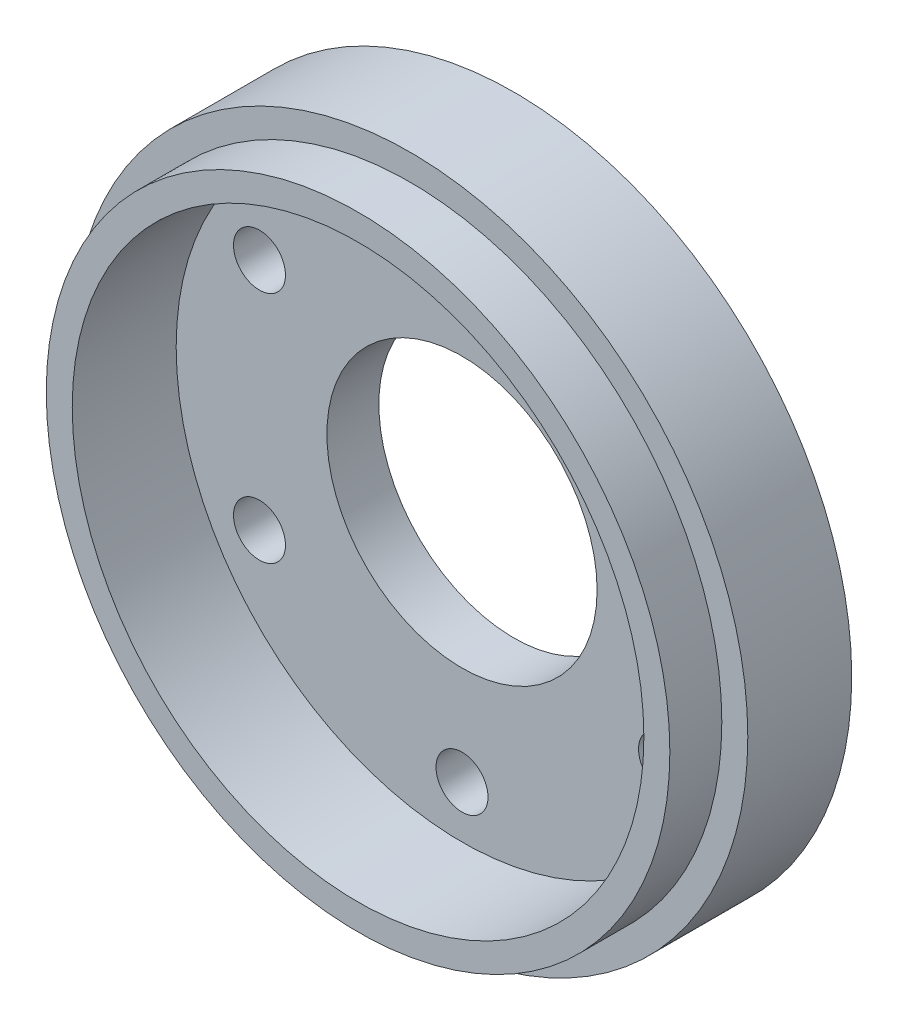
ISO-10303-21;
HEADER;
FILE_DESCRIPTION(('STEP AP214'),'2;1');
FILE_NAME('part.step','',(''),(''),'','','');
FILE_SCHEMA(('AUTOMOTIVE_DESIGN { 1 0 10303 214 1 1 1 1 }'));
ENDSEC;
DATA;
#1=APPLICATION_CONTEXT('core data for automotive mechanical design processes');
#2=APPLICATION_PROTOCOL_DEFINITION('international standard','automotive_design',2000,#1);
#3=PRODUCT_CONTEXT('',#1,'mechanical');
#4=PRODUCT('Part','Part','',(#3));
#5=PRODUCT_RELATED_PRODUCT_CATEGORY('part','',(#4));
#6=PRODUCT_DEFINITION_FORMATION('','',#4);
#7=PRODUCT_DEFINITION_CONTEXT('part definition',#1,'design');
#8=PRODUCT_DEFINITION('design','',#6,#7);
#9=PRODUCT_DEFINITION_SHAPE('','',#8);
#10=(LENGTH_UNIT() NAMED_UNIT(*) SI_UNIT(.MILLI.,.METRE.));
#11=(NAMED_UNIT(*) PLANE_ANGLE_UNIT() SI_UNIT($,.RADIAN.));
#12=(NAMED_UNIT(*) SI_UNIT($,.STERADIAN.) SOLID_ANGLE_UNIT());
#13=UNCERTAINTY_MEASURE_WITH_UNIT(LENGTH_MEASURE(1.E-05),#10,'distance_accuracy_value','');
#14=(GEOMETRIC_REPRESENTATION_CONTEXT(3) GLOBAL_UNCERTAINTY_ASSIGNED_CONTEXT((#13)) GLOBAL_UNIT_ASSIGNED_CONTEXT((#10,
#11,#12)) REPRESENTATION_CONTEXT('',''));
#15=CARTESIAN_POINT('',(0.,0.,0.));
#16=DIRECTION('',(0.,0.,1.));
#17=DIRECTION('',(1.,0.,0.));
#18=AXIS2_PLACEMENT_3D('',#15,#16,#17);
#19=CARTESIAN_POINT('',(0.,0.,10.));
#20=DIRECTION('',(0.,0.,1.));
#21=DIRECTION('',(1.,0.,0.));
#22=AXIS2_PLACEMENT_3D('',#19,#20,#21);
#23=PLANE('',#22);
#24=CARTESIAN_POINT('',(0.,0.,10.));
#25=DIRECTION('',(0.,0.,1.));
#26=DIRECTION('',(1.,0.,0.));
#27=AXIS2_PLACEMENT_3D('',#24,#25,#26);
#28=CIRCLE('',#27,32.5);
#29=CARTESIAN_POINT('',(32.5,0.,10.));
#30=VERTEX_POINT('',#29);
#31=EDGE_CURVE('E68',#30,#30,#28,.T.);
#32=ORIENTED_EDGE('',*,*,#31,.T.);
#33=EDGE_LOOP('',(#32));
#34=FACE_BOUND('',#33,.T.);
#35=CARTESIAN_POINT('',(0.,0.,10.));
#36=DIRECTION('',(0.,0.,1.));
#37=DIRECTION('',(1.,0.,0.));
#38=AXIS2_PLACEMENT_3D('',#35,#36,#37);
#39=CIRCLE('',#38,30.);
#40=CARTESIAN_POINT('',(30.,0.,10.));
#41=VERTEX_POINT('',#40);
#42=EDGE_CURVE('E122',#41,#41,#39,.T.);
#43=ORIENTED_EDGE('',*,*,#42,.F.);
#44=EDGE_LOOP('',(#43));
#45=FACE_BOUND('',#44,.T.);
#46=ADVANCED_FACE('F43',(#34,#45),#23,.T.);
#47=CARTESIAN_POINT('',(0.,0.,5.));
#48=DIRECTION('',(0.,0.,1.));
#49=DIRECTION('',(1.,0.,0.));
#50=AXIS2_PLACEMENT_3D('',#47,#48,#49);
#51=PLANE('',#50);
#52=CARTESIAN_POINT('',(0.,22.5,5.));
#53=DIRECTION('',(0.,0.,1.));
#54=DIRECTION('',(1.,0.,0.));
#55=AXIS2_PLACEMENT_3D('',#52,#53,#54);
#56=CIRCLE('',#55,2.5);
#57=CARTESIAN_POINT('',(2.5,22.5,5.));
#58=VERTEX_POINT('',#57);
#59=EDGE_CURVE('E107',#58,#58,#56,.T.);
#60=ORIENTED_EDGE('',*,*,#59,.F.);
#61=EDGE_LOOP('',(#60));
#62=FACE_BOUND('',#61,.T.);
#63=CARTESIAN_POINT('',(-19.4855715851499,11.25,5.));
#64=DIRECTION('',(0.,0.,1.));
#65=DIRECTION('',(1.,0.,0.));
#66=AXIS2_PLACEMENT_3D('',#63,#64,#65);
#67=CIRCLE('',#66,2.5);
#68=CARTESIAN_POINT('',(-16.9855715851499,11.25,5.));
#69=VERTEX_POINT('',#68);
#70=EDGE_CURVE('E79',#69,#69,#67,.T.);
#71=ORIENTED_EDGE('',*,*,#70,.F.);
#72=EDGE_LOOP('',(#71));
#73=FACE_BOUND('',#72,.T.);
#74=CARTESIAN_POINT('',(-19.4855715851499,-11.25,5.));
#75=DIRECTION('',(0.,0.,1.));
#76=DIRECTION('',(1.,0.,0.));
#77=AXIS2_PLACEMENT_3D('',#74,#75,#76);
#78=CIRCLE('',#77,2.49999999999999);
#79=CARTESIAN_POINT('',(-16.9855715851499,-11.25,5.));
#80=VERTEX_POINT('',#79);
#81=EDGE_CURVE('E78',#80,#80,#78,.T.);
#82=ORIENTED_EDGE('',*,*,#81,.F.);
#83=EDGE_LOOP('',(#82));
#84=FACE_BOUND('',#83,.T.);
#85=CARTESIAN_POINT('',(0.,-22.5,5.));
#86=DIRECTION('',(0.,0.,1.));
#87=DIRECTION('',(1.,0.,0.));
#88=AXIS2_PLACEMENT_3D('',#85,#86,#87);
#89=CIRCLE('',#88,2.5);
#90=CARTESIAN_POINT('',(2.50000000000001,-22.5,5.));
#91=VERTEX_POINT('',#90);
#92=EDGE_CURVE('E87',#91,#91,#89,.T.);
#93=ORIENTED_EDGE('',*,*,#92,.F.);
#94=EDGE_LOOP('',(#93));
#95=FACE_BOUND('',#94,.T.);
#96=CARTESIAN_POINT('',(19.4855715851499,-11.25,5.));
#97=DIRECTION('',(0.,0.,1.));
#98=DIRECTION('',(1.,0.,0.));
#99=AXIS2_PLACEMENT_3D('',#96,#97,#98);
#100=CIRCLE('',#99,2.5);
#101=CARTESIAN_POINT('',(21.9855715851499,-11.25,5.));
#102=VERTEX_POINT('',#101);
#103=EDGE_CURVE('E95',#102,#102,#100,.T.);
#104=ORIENTED_EDGE('',*,*,#103,.F.);
#105=EDGE_LOOP('',(#104));
#106=FACE_BOUND('',#105,.T.);
#107=CARTESIAN_POINT('',(19.4855715851499,11.25,5.));
#108=DIRECTION('',(0.,0.,1.));
#109=DIRECTION('',(1.,0.,0.));
#110=AXIS2_PLACEMENT_3D('',#107,#108,#109);
#111=CIRCLE('',#110,2.5);
#112=CARTESIAN_POINT('',(21.9855715851499,11.25,5.));
#113=VERTEX_POINT('',#112);
#114=EDGE_CURVE('E103',#113,#113,#111,.T.);
#115=ORIENTED_EDGE('',*,*,#114,.F.);
#116=EDGE_LOOP('',(#115));
#117=FACE_BOUND('',#116,.T.);
#118=CARTESIAN_POINT('',(0.,0.,5.));
#119=DIRECTION('',(0.,0.,1.));
#120=DIRECTION('',(1.,0.,0.));
#121=AXIS2_PLACEMENT_3D('',#118,#119,#120);
#122=CIRCLE('',#121,13.);
#123=CARTESIAN_POINT('',(13.,0.,5.));
#124=VERTEX_POINT('',#123);
#125=EDGE_CURVE('E57',#124,#124,#122,.T.);
#126=ORIENTED_EDGE('',*,*,#125,.F.);
#127=EDGE_LOOP('',(#126));
#128=FACE_BOUND('',#127,.T.);
#129=CARTESIAN_POINT('',(0.,0.,5.));
#130=DIRECTION('',(0.,0.,1.));
#131=DIRECTION('',(1.,0.,0.));
#132=AXIS2_PLACEMENT_3D('',#129,#130,#131);
#133=CIRCLE('',#132,27.5);
#134=CARTESIAN_POINT('',(27.5,0.,5.));
#135=VERTEX_POINT('',#134);
#136=EDGE_CURVE('E10',#135,#135,#133,.F.);
#137=ORIENTED_EDGE('',*,*,#136,.F.);
#138=EDGE_LOOP('',(#137));
#139=FACE_BOUND('',#138,.T.);
#140=ADVANCED_FACE('F154',(#62,#73,#84,#95,#106,#117,#128,#139),#51,.T.);
#141=CARTESIAN_POINT('',(0.,0.,0.));
#142=DIRECTION('',(0.,0.,1.));
#143=DIRECTION('',(1.,0.,0.));
#144=AXIS2_PLACEMENT_3D('',#141,#142,#143);
#145=PLANE('',#144);
#146=CARTESIAN_POINT('',(0.,22.5,0.));
#147=DIRECTION('',(0.,0.,1.));
#148=DIRECTION('',(1.,0.,0.));
#149=AXIS2_PLACEMENT_3D('',#146,#147,#148);
#150=CIRCLE('',#149,2.5);
#151=CARTESIAN_POINT('',(2.5,22.5,0.));
#152=VERTEX_POINT('',#151);
#153=EDGE_CURVE('E73',#152,#152,#150,.T.);
#154=ORIENTED_EDGE('',*,*,#153,.T.);
#155=EDGE_LOOP('',(#154));
#156=FACE_BOUND('',#155,.T.);
#157=CARTESIAN_POINT('',(-19.4855715851499,11.25,0.));
#158=DIRECTION('',(0.,0.,1.));
#159=DIRECTION('',(1.,0.,0.));
#160=AXIS2_PLACEMENT_3D('',#157,#158,#159);
#161=CIRCLE('',#160,2.5);
#162=CARTESIAN_POINT('',(-16.9855715851499,11.25,0.));
#163=VERTEX_POINT('',#162);
#164=EDGE_CURVE('E108',#163,#163,#161,.T.);
#165=ORIENTED_EDGE('',*,*,#164,.T.);
#166=EDGE_LOOP('',(#165));
#167=FACE_BOUND('',#166,.T.);
#168=CARTESIAN_POINT('',(-19.4855715851499,-11.25,0.));
#169=DIRECTION('',(0.,0.,1.));
#170=DIRECTION('',(1.,0.,0.));
#171=AXIS2_PLACEMENT_3D('',#168,#169,#170);
#172=CIRCLE('',#171,2.49999999999999);
#173=CARTESIAN_POINT('',(-16.9855715851499,-11.25,0.));
#174=VERTEX_POINT('',#173);
#175=EDGE_CURVE('E74',#174,#174,#172,.T.);
#176=ORIENTED_EDGE('',*,*,#175,.T.);
#177=EDGE_LOOP('',(#176));
#178=FACE_BOUND('',#177,.T.);
#179=CARTESIAN_POINT('',(0.,-22.5,0.));
#180=DIRECTION('',(0.,0.,1.));
#181=DIRECTION('',(1.,0.,0.));
#182=AXIS2_PLACEMENT_3D('',#179,#180,#181);
#183=CIRCLE('',#182,2.5);
#184=CARTESIAN_POINT('',(2.50000000000001,-22.5,0.));
#185=VERTEX_POINT('',#184);
#186=EDGE_CURVE('E83',#185,#185,#183,.T.);
#187=ORIENTED_EDGE('',*,*,#186,.T.);
#188=EDGE_LOOP('',(#187));
#189=FACE_BOUND('',#188,.T.);
#190=CARTESIAN_POINT('',(19.4855715851499,-11.25,0.));
#191=DIRECTION('',(0.,0.,1.));
#192=DIRECTION('',(1.,0.,0.));
#193=AXIS2_PLACEMENT_3D('',#190,#191,#192);
#194=CIRCLE('',#193,2.5);
#195=CARTESIAN_POINT('',(21.9855715851499,-11.25,0.));
#196=VERTEX_POINT('',#195);
#197=EDGE_CURVE('E91',#196,#196,#194,.T.);
#198=ORIENTED_EDGE('',*,*,#197,.T.);
#199=EDGE_LOOP('',(#198));
#200=FACE_BOUND('',#199,.T.);
#201=CARTESIAN_POINT('',(19.4855715851499,11.25,0.));
#202=DIRECTION('',(0.,0.,1.));
#203=DIRECTION('',(1.,0.,0.));
#204=AXIS2_PLACEMENT_3D('',#201,#202,#203);
#205=CIRCLE('',#204,2.5);
#206=CARTESIAN_POINT('',(21.9855715851499,11.25,0.));
#207=VERTEX_POINT('',#206);
#208=EDGE_CURVE('E99',#207,#207,#205,.T.);
#209=ORIENTED_EDGE('',*,*,#208,.T.);
#210=EDGE_LOOP('',(#209));
#211=FACE_BOUND('',#210,.T.);
#212=CARTESIAN_POINT('',(0.,0.,0.));
#213=DIRECTION('',(0.,0.,1.));
#214=DIRECTION('',(1.,0.,0.));
#215=AXIS2_PLACEMENT_3D('',#212,#213,#214);
#216=CIRCLE('',#215,32.5);
#217=CARTESIAN_POINT('',(32.5,0.,0.));
#218=VERTEX_POINT('',#217);
#219=EDGE_CURVE('E51',#218,#218,#216,.T.);
#220=ORIENTED_EDGE('',*,*,#219,.F.);
#221=EDGE_LOOP('',(#220));
#222=FACE_BOUND('',#221,.T.);
#223=CARTESIAN_POINT('',(0.,0.,0.));
#224=DIRECTION('',(0.,0.,1.));
#225=DIRECTION('',(1.,0.,0.));
#226=AXIS2_PLACEMENT_3D('',#223,#224,#225);
#227=CIRCLE('',#226,13.);
#228=CARTESIAN_POINT('',(13.,0.,0.));
#229=VERTEX_POINT('',#228);
#230=EDGE_CURVE('E63',#229,#229,#227,.T.);
#231=ORIENTED_EDGE('',*,*,#230,.T.);
#232=EDGE_LOOP('',(#231));
#233=FACE_BOUND('',#232,.T.);
#234=ADVANCED_FACE('F161',(#156,#167,#178,#189,#200,#211,#222,#233),#145,.F.);
#235=CARTESIAN_POINT('',(0.,0.,5.));
#236=DIRECTION('',(0.,0.,-1.));
#237=DIRECTION('',(-1.,0.,0.));
#238=AXIS2_PLACEMENT_3D('',#235,#236,#237);
#239=CYLINDRICAL_SURFACE('',#238,32.5);
#240=ORIENTED_EDGE('',*,*,#219,.T.);
#241=EDGE_LOOP('',(#240));
#242=FACE_BOUND('',#241,.T.);
#243=ORIENTED_EDGE('',*,*,#31,.F.);
#244=EDGE_LOOP('',(#243));
#245=FACE_BOUND('',#244,.T.);
#246=ADVANCED_FACE('F45',(#242,#245),#239,.T.);
#247=CARTESIAN_POINT('',(0.,0.,5.));
#248=DIRECTION('',(0.,0.,-1.));
#249=DIRECTION('',(-1.,0.,0.));
#250=AXIS2_PLACEMENT_3D('',#247,#248,#249);
#251=CYLINDRICAL_SURFACE('',#250,13.);
#252=ORIENTED_EDGE('',*,*,#125,.T.);
#253=EDGE_LOOP('',(#252));
#254=FACE_BOUND('',#253,.T.);
#255=ORIENTED_EDGE('',*,*,#230,.F.);
#256=EDGE_LOOP('',(#255));
#257=FACE_BOUND('',#256,.T.);
#258=ADVANCED_FACE('F168',(#254,#257),#251,.F.);
#259=CARTESIAN_POINT('',(0.,0.,10.));
#260=DIRECTION('',(0.,0.,-1.));
#261=DIRECTION('',(-1.,0.,0.));
#262=AXIS2_PLACEMENT_3D('',#259,#260,#261);
#263=CYLINDRICAL_SURFACE('',#262,27.5);
#264=ORIENTED_EDGE('',*,*,#136,.T.);
#265=EDGE_LOOP('',(#264));
#266=FACE_BOUND('',#265,.T.);
#267=CARTESIAN_POINT('',(0.,0.,15.));
#268=DIRECTION('',(0.,0.,1.));
#269=DIRECTION('',(1.,0.,0.));
#270=AXIS2_PLACEMENT_3D('',#267,#268,#269);
#271=CIRCLE('',#270,27.5);
#272=CARTESIAN_POINT('',(27.5,0.,15.));
#273=VERTEX_POINT('',#272);
#274=EDGE_CURVE('E126',#273,#273,#271,.T.);
#275=ORIENTED_EDGE('',*,*,#274,.T.);
#276=EDGE_LOOP('',(#275));
#277=FACE_BOUND('',#276,.T.);
#278=ADVANCED_FACE('F135',(#266,#277),#263,.F.);
#279=CARTESIAN_POINT('',(19.4855715851499,11.25,0.));
#280=DIRECTION('',(0.,0.,1.));
#281=DIRECTION('',(1.,0.,0.));
#282=AXIS2_PLACEMENT_3D('',#279,#280,#281);
#283=CYLINDRICAL_SURFACE('',#282,2.5);
#284=ORIENTED_EDGE('',*,*,#208,.F.);
#285=EDGE_LOOP('',(#284));
#286=FACE_BOUND('',#285,.T.);
#287=ORIENTED_EDGE('',*,*,#114,.T.);
#288=EDGE_LOOP('',(#287));
#289=FACE_BOUND('',#288,.T.);
#290=ADVANCED_FACE('F193',(#286,#289),#283,.F.);
#291=CARTESIAN_POINT('',(19.4855715851499,-11.25,0.));
#292=DIRECTION('',(0.,0.,1.));
#293=DIRECTION('',(1.,0.,0.));
#294=AXIS2_PLACEMENT_3D('',#291,#292,#293);
#295=CYLINDRICAL_SURFACE('',#294,2.5);
#296=ORIENTED_EDGE('',*,*,#197,.F.);
#297=EDGE_LOOP('',(#296));
#298=FACE_BOUND('',#297,.T.);
#299=ORIENTED_EDGE('',*,*,#103,.T.);
#300=EDGE_LOOP('',(#299));
#301=FACE_BOUND('',#300,.T.);
#302=ADVANCED_FACE('F196',(#298,#301),#295,.F.);
#303=CARTESIAN_POINT('',(0.,-22.5,0.));
#304=DIRECTION('',(0.,0.,1.));
#305=DIRECTION('',(1.,0.,0.));
#306=AXIS2_PLACEMENT_3D('',#303,#304,#305);
#307=CYLINDRICAL_SURFACE('',#306,2.5);
#308=ORIENTED_EDGE('',*,*,#186,.F.);
#309=EDGE_LOOP('',(#308));
#310=FACE_BOUND('',#309,.T.);
#311=ORIENTED_EDGE('',*,*,#92,.T.);
#312=EDGE_LOOP('',(#311));
#313=FACE_BOUND('',#312,.T.);
#314=ADVANCED_FACE('F205',(#310,#313),#307,.F.);
#315=CARTESIAN_POINT('',(-19.4855715851499,-11.25,0.));
#316=DIRECTION('',(0.,0.,1.));
#317=DIRECTION('',(1.,0.,0.));
#318=AXIS2_PLACEMENT_3D('',#315,#316,#317);
#319=CYLINDRICAL_SURFACE('',#318,2.49999999999999);
#320=ORIENTED_EDGE('',*,*,#175,.F.);
#321=EDGE_LOOP('',(#320));
#322=FACE_BOUND('',#321,.T.);
#323=ORIENTED_EDGE('',*,*,#81,.T.);
#324=EDGE_LOOP('',(#323));
#325=FACE_BOUND('',#324,.T.);
#326=ADVANCED_FACE('F211',(#322,#325),#319,.F.);
#327=CARTESIAN_POINT('',(-19.4855715851499,11.25,0.));
#328=DIRECTION('',(0.,0.,1.));
#329=DIRECTION('',(1.,0.,0.));
#330=AXIS2_PLACEMENT_3D('',#327,#328,#329);
#331=CYLINDRICAL_SURFACE('',#330,2.5);
#332=ORIENTED_EDGE('',*,*,#164,.F.);
#333=EDGE_LOOP('',(#332));
#334=FACE_BOUND('',#333,.T.);
#335=ORIENTED_EDGE('',*,*,#70,.T.);
#336=EDGE_LOOP('',(#335));
#337=FACE_BOUND('',#336,.T.);
#338=ADVANCED_FACE('F150',(#334,#337),#331,.F.);
#339=CARTESIAN_POINT('',(0.,22.5,0.));
#340=DIRECTION('',(0.,0.,1.));
#341=DIRECTION('',(1.,0.,0.));
#342=AXIS2_PLACEMENT_3D('',#339,#340,#341);
#343=CYLINDRICAL_SURFACE('',#342,2.5);
#344=ORIENTED_EDGE('',*,*,#153,.F.);
#345=EDGE_LOOP('',(#344));
#346=FACE_BOUND('',#345,.T.);
#347=ORIENTED_EDGE('',*,*,#59,.T.);
#348=EDGE_LOOP('',(#347));
#349=FACE_BOUND('',#348,.T.);
#350=ADVANCED_FACE('F140',(#346,#349),#343,.F.);
#351=CARTESIAN_POINT('',(0.,0.,15.));
#352=DIRECTION('',(0.,0.,1.));
#353=DIRECTION('',(1.,0.,0.));
#354=AXIS2_PLACEMENT_3D('',#351,#352,#353);
#355=PLANE('',#354);
#356=CARTESIAN_POINT('',(0.,0.,15.));
#357=DIRECTION('',(0.,0.,1.));
#358=DIRECTION('',(1.,0.,0.));
#359=AXIS2_PLACEMENT_3D('',#356,#357,#358);
#360=CIRCLE('',#359,30.);
#361=CARTESIAN_POINT('',(30.,0.,15.));
#362=VERTEX_POINT('',#361);
#363=EDGE_CURVE('E112',#362,#362,#360,.T.);
#364=ORIENTED_EDGE('',*,*,#363,.T.);
#365=EDGE_LOOP('',(#364));
#366=FACE_BOUND('',#365,.T.);
#367=ORIENTED_EDGE('',*,*,#274,.F.);
#368=EDGE_LOOP('',(#367));
#369=FACE_BOUND('',#368,.T.);
#370=ADVANCED_FACE('F137',(#366,#369),#355,.T.);
#371=CARTESIAN_POINT('',(0.,0.,15.));
#372=DIRECTION('',(0.,0.,-1.));
#373=DIRECTION('',(-1.,0.,0.));
#374=AXIS2_PLACEMENT_3D('',#371,#372,#373);
#375=CYLINDRICAL_SURFACE('',#374,30.);
#376=ORIENTED_EDGE('',*,*,#363,.F.);
#377=EDGE_LOOP('',(#376));
#378=FACE_BOUND('',#377,.T.);
#379=ORIENTED_EDGE('',*,*,#42,.T.);
#380=EDGE_LOOP('',(#379));
#381=FACE_BOUND('',#380,.T.);
#382=ADVANCED_FACE('F139',(#378,#381),#375,.T.);
#383=CLOSED_SHELL('',(#46,#140,#234,#246,#258,#278,#290,#302,#314,#326,#338,#350,#370,#382));
#384=MANIFOLD_SOLID_BREP('B2',#383);
#385=ADVANCED_BREP_SHAPE_REPRESENTATION('',(#18,#384),#14);
#386=SHAPE_DEFINITION_REPRESENTATION(#9,#385);
ENDSEC;
END-ISO-10303-21;
